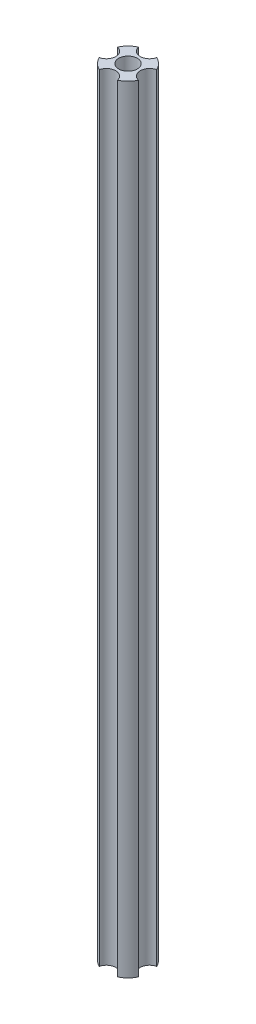
ISO-10303-21;
HEADER;
FILE_DESCRIPTION(('STEP AP214'),'2;1');
FILE_NAME('part.step','',(''),(''),'','','');
FILE_SCHEMA(('AUTOMOTIVE_DESIGN { 1 0 10303 214 1 1 1 1 }'));
ENDSEC;
DATA;
#1=APPLICATION_CONTEXT('core data for automotive mechanical design processes');
#2=APPLICATION_PROTOCOL_DEFINITION('international standard','automotive_design',2000,#1);
#3=PRODUCT_CONTEXT('',#1,'mechanical');
#4=PRODUCT('Part','Part','',(#3));
#5=PRODUCT_RELATED_PRODUCT_CATEGORY('part','',(#4));
#6=PRODUCT_DEFINITION_FORMATION('','',#4);
#7=PRODUCT_DEFINITION_CONTEXT('part definition',#1,'design');
#8=PRODUCT_DEFINITION('design','',#6,#7);
#9=PRODUCT_DEFINITION_SHAPE('','',#8);
#10=(LENGTH_UNIT() NAMED_UNIT(*) SI_UNIT(.MILLI.,.METRE.));
#11=(NAMED_UNIT(*) PLANE_ANGLE_UNIT() SI_UNIT($,.RADIAN.));
#12=(NAMED_UNIT(*) SI_UNIT($,.STERADIAN.) SOLID_ANGLE_UNIT());
#13=UNCERTAINTY_MEASURE_WITH_UNIT(LENGTH_MEASURE(1.E-05),#10,'distance_accuracy_value','');
#14=(GEOMETRIC_REPRESENTATION_CONTEXT(3) GLOBAL_UNCERTAINTY_ASSIGNED_CONTEXT((#13)) GLOBAL_UNIT_ASSIGNED_CONTEXT((#10,
#11,#12)) REPRESENTATION_CONTEXT('',''));
#15=CARTESIAN_POINT('',(0.,0.,0.));
#16=DIRECTION('',(0.,0.,1.));
#17=DIRECTION('',(1.,0.,0.));
#18=AXIS2_PLACEMENT_3D('',#15,#16,#17);
#19=CARTESIAN_POINT('',(1.7375,125.,0.));
#20=DIRECTION('',(0.,1.,0.));
#21=DIRECTION('',(0.,0.,1.));
#22=AXIS2_PLACEMENT_3D('',#19,#20,#21);
#23=PLANE('',#22);
#24=CARTESIAN_POINT('',(0.,125.,0.));
#25=DIRECTION('',(0.,1.,0.));
#26=DIRECTION('',(0.,0.,1.));
#27=AXIS2_PLACEMENT_3D('',#24,#25,#26);
#28=CIRCLE('',#27,3.475);
#29=CARTESIAN_POINT('',(1.46464731599824,125.,3.15125899280576));
#30=VERTEX_POINT('',#29);
#31=CARTESIAN_POINT('',(3.15125899280576,125.,1.46464731599824));
#32=VERTEX_POINT('',#31);
#33=EDGE_CURVE('E170',#30,#32,#28,.T.);
#34=ORIENTED_EDGE('',*,*,#33,.T.);
#35=CARTESIAN_POINT('',(3.475,125.,0.));
#36=DIRECTION('',(0.,-1.,0.));
#37=DIRECTION('',(0.,0.,1.));
#38=AXIS2_PLACEMENT_3D('',#35,#36,#37);
#39=CIRCLE('',#38,1.5);
#40=CARTESIAN_POINT('',(3.15125899280576,125.,-1.46464731599824));
#41=VERTEX_POINT('',#40);
#42=EDGE_CURVE('E106',#32,#41,#39,.T.);
#43=ORIENTED_EDGE('',*,*,#42,.T.);
#44=CARTESIAN_POINT('',(0.,125.,0.));
#45=DIRECTION('',(0.,1.,0.));
#46=DIRECTION('',(0.,0.,1.));
#47=AXIS2_PLACEMENT_3D('',#44,#45,#46);
#48=CIRCLE('',#47,3.475);
#49=CARTESIAN_POINT('',(1.46464731599824,125.,-3.15125899280576));
#50=VERTEX_POINT('',#49);
#51=EDGE_CURVE('E191',#41,#50,#48,.T.);
#52=ORIENTED_EDGE('',*,*,#51,.T.);
#53=CARTESIAN_POINT('',(0.,125.,-3.475));
#54=DIRECTION('',(0.,-1.,0.));
#55=DIRECTION('',(0.,0.,1.));
#56=AXIS2_PLACEMENT_3D('',#53,#54,#55);
#57=CIRCLE('',#56,1.5);
#58=CARTESIAN_POINT('',(-1.46464731599824,125.,-3.15125899280576));
#59=VERTEX_POINT('',#58);
#60=EDGE_CURVE('E205',#50,#59,#57,.T.);
#61=ORIENTED_EDGE('',*,*,#60,.T.);
#62=CARTESIAN_POINT('',(0.,125.,0.));
#63=DIRECTION('',(0.,1.,0.));
#64=DIRECTION('',(0.,0.,1.));
#65=AXIS2_PLACEMENT_3D('',#62,#63,#64);
#66=CIRCLE('',#65,3.475);
#67=CARTESIAN_POINT('',(-3.15125899280576,125.,-1.46464731599824));
#68=VERTEX_POINT('',#67);
#69=EDGE_CURVE('E125',#59,#68,#66,.T.);
#70=ORIENTED_EDGE('',*,*,#69,.T.);
#71=CARTESIAN_POINT('',(-3.475,125.,0.));
#72=DIRECTION('',(0.,-1.,0.));
#73=DIRECTION('',(0.,0.,1.));
#74=AXIS2_PLACEMENT_3D('',#71,#72,#73);
#75=CIRCLE('',#74,1.5);
#76=CARTESIAN_POINT('',(-3.15125899280576,125.,1.46464731599824));
#77=VERTEX_POINT('',#76);
#78=EDGE_CURVE('E119',#68,#77,#75,.T.);
#79=ORIENTED_EDGE('',*,*,#78,.T.);
#80=CARTESIAN_POINT('',(0.,125.,0.));
#81=DIRECTION('',(0.,1.,0.));
#82=DIRECTION('',(0.,0.,1.));
#83=AXIS2_PLACEMENT_3D('',#80,#81,#82);
#84=CIRCLE('',#83,3.475);
#85=CARTESIAN_POINT('',(-1.46464731599824,125.,3.15125899280576));
#86=VERTEX_POINT('',#85);
#87=EDGE_CURVE('E123',#77,#86,#84,.T.);
#88=ORIENTED_EDGE('',*,*,#87,.T.);
#89=CARTESIAN_POINT('',(0.,125.,3.475));
#90=DIRECTION('',(0.,-1.,0.));
#91=DIRECTION('',(0.,0.,1.));
#92=AXIS2_PLACEMENT_3D('',#89,#90,#91);
#93=CIRCLE('',#92,1.5);
#94=EDGE_CURVE('E63',#86,#30,#93,.T.);
#95=ORIENTED_EDGE('',*,*,#94,.T.);
#96=EDGE_LOOP('',(#34,#43,#52,#61,#70,#79,#88,#95));
#97=FACE_BOUND('',#96,.T.);
#98=CARTESIAN_POINT('',(0.,125.,0.));
#99=DIRECTION('',(0.,1.,0.));
#100=DIRECTION('',(0.,0.,1.));
#101=AXIS2_PLACEMENT_3D('',#98,#99,#100);
#102=CIRCLE('',#101,1.5);
#103=CARTESIAN_POINT('',(0.,125.,1.5));
#104=VERTEX_POINT('',#103);
#105=EDGE_CURVE('E152',#104,#104,#102,.T.);
#106=ORIENTED_EDGE('',*,*,#105,.F.);
#107=EDGE_LOOP('',(#106));
#108=FACE_BOUND('',#107,.T.);
#109=ADVANCED_FACE('F45',(#97,#108),#23,.T.);
#110=CARTESIAN_POINT('',(1.7375,0.,0.));
#111=DIRECTION('',(0.,1.,0.));
#112=DIRECTION('',(0.,0.,1.));
#113=AXIS2_PLACEMENT_3D('',#110,#111,#112);
#114=PLANE('',#113);
#115=CARTESIAN_POINT('',(0.,0.,0.));
#116=DIRECTION('',(0.,1.,0.));
#117=DIRECTION('',(0.,0.,1.));
#118=AXIS2_PLACEMENT_3D('',#115,#116,#117);
#119=CIRCLE('',#118,3.475);
#120=CARTESIAN_POINT('',(1.46464731599824,0.,3.15125899280576));
#121=VERTEX_POINT('',#120);
#122=CARTESIAN_POINT('',(3.15125899280576,0.,1.46464731599824));
#123=VERTEX_POINT('',#122);
#124=EDGE_CURVE('E147',#121,#123,#119,.T.);
#125=ORIENTED_EDGE('',*,*,#124,.F.);
#126=CARTESIAN_POINT('',(0.,0.,3.475));
#127=DIRECTION('',(0.,-1.,0.));
#128=DIRECTION('',(0.,0.,1.));
#129=AXIS2_PLACEMENT_3D('',#126,#127,#128);
#130=CIRCLE('',#129,1.5);
#131=CARTESIAN_POINT('',(-1.46464731599824,0.,3.15125899280576));
#132=VERTEX_POINT('',#131);
#133=EDGE_CURVE('E98',#132,#121,#130,.T.);
#134=ORIENTED_EDGE('',*,*,#133,.F.);
#135=CARTESIAN_POINT('',(0.,0.,0.));
#136=DIRECTION('',(0.,1.,0.));
#137=DIRECTION('',(0.,0.,1.));
#138=AXIS2_PLACEMENT_3D('',#135,#136,#137);
#139=CIRCLE('',#138,3.475);
#140=CARTESIAN_POINT('',(-3.15125899280576,0.,1.46464731599824));
#141=VERTEX_POINT('',#140);
#142=EDGE_CURVE('E92',#141,#132,#139,.T.);
#143=ORIENTED_EDGE('',*,*,#142,.F.);
#144=CARTESIAN_POINT('',(-3.475,0.,0.));
#145=DIRECTION('',(0.,-1.,0.));
#146=DIRECTION('',(0.,0.,1.));
#147=AXIS2_PLACEMENT_3D('',#144,#145,#146);
#148=CIRCLE('',#147,1.5);
#149=CARTESIAN_POINT('',(-3.15125899280576,0.,-1.46464731599824));
#150=VERTEX_POINT('',#149);
#151=EDGE_CURVE('E134',#150,#141,#148,.T.);
#152=ORIENTED_EDGE('',*,*,#151,.F.);
#153=CARTESIAN_POINT('',(0.,0.,0.));
#154=DIRECTION('',(0.,1.,0.));
#155=DIRECTION('',(0.,0.,1.));
#156=AXIS2_PLACEMENT_3D('',#153,#154,#155);
#157=CIRCLE('',#156,3.475);
#158=CARTESIAN_POINT('',(-1.46464731599824,0.,-3.15125899280576));
#159=VERTEX_POINT('',#158);
#160=EDGE_CURVE('E161',#159,#150,#157,.T.);
#161=ORIENTED_EDGE('',*,*,#160,.F.);
#162=CARTESIAN_POINT('',(0.,0.,-3.475));
#163=DIRECTION('',(0.,-1.,0.));
#164=DIRECTION('',(0.,0.,1.));
#165=AXIS2_PLACEMENT_3D('',#162,#163,#164);
#166=CIRCLE('',#165,1.5);
#167=CARTESIAN_POINT('',(1.46464731599824,0.,-3.15125899280576));
#168=VERTEX_POINT('',#167);
#169=EDGE_CURVE('E158',#168,#159,#166,.T.);
#170=ORIENTED_EDGE('',*,*,#169,.F.);
#171=CARTESIAN_POINT('',(0.,0.,0.));
#172=DIRECTION('',(0.,1.,0.));
#173=DIRECTION('',(0.,0.,1.));
#174=AXIS2_PLACEMENT_3D('',#171,#172,#173);
#175=CIRCLE('',#174,3.475);
#176=CARTESIAN_POINT('',(3.15125899280576,0.,-1.46464731599824));
#177=VERTEX_POINT('',#176);
#178=EDGE_CURVE('E155',#177,#168,#175,.T.);
#179=ORIENTED_EDGE('',*,*,#178,.F.);
#180=CARTESIAN_POINT('',(3.475,0.,0.));
#181=DIRECTION('',(0.,-1.,0.));
#182=DIRECTION('',(0.,0.,1.));
#183=AXIS2_PLACEMENT_3D('',#180,#181,#182);
#184=CIRCLE('',#183,1.5);
#185=EDGE_CURVE('E151',#123,#177,#184,.T.);
#186=ORIENTED_EDGE('',*,*,#185,.F.);
#187=EDGE_LOOP('',(#125,#134,#143,#152,#161,#170,#179,#186));
#188=FACE_BOUND('',#187,.T.);
#189=CARTESIAN_POINT('',(0.,0.,0.));
#190=DIRECTION('',(0.,1.,0.));
#191=DIRECTION('',(0.,0.,1.));
#192=AXIS2_PLACEMENT_3D('',#189,#190,#191);
#193=CIRCLE('',#192,1.5);
#194=CARTESIAN_POINT('',(0.,0.,1.5));
#195=VERTEX_POINT('',#194);
#196=EDGE_CURVE('E215',#195,#195,#193,.T.);
#197=ORIENTED_EDGE('',*,*,#196,.T.);
#198=EDGE_LOOP('',(#197));
#199=FACE_BOUND('',#198,.T.);
#200=ADVANCED_FACE('F195',(#188,#199),#114,.F.);
#201=CARTESIAN_POINT('',(0.,125.,0.));
#202=DIRECTION('',(0.,-1.,0.));
#203=DIRECTION('',(0.,0.,-1.));
#204=AXIS2_PLACEMENT_3D('',#201,#202,#203);
#205=CYLINDRICAL_SURFACE('',#204,3.475);
#206=ORIENTED_EDGE('',*,*,#124,.T.);
#207=DIRECTION('',(0.,-1.,0.));
#208=VECTOR('',#207,1.);
#209=CARTESIAN_POINT('',(3.15125899280576,125.,1.46464731599824));
#210=LINE('',#209,#208);
#211=EDGE_CURVE('E11',#32,#123,#210,.T.);
#212=ORIENTED_EDGE('',*,*,#211,.F.);
#213=ORIENTED_EDGE('',*,*,#33,.F.);
#214=DIRECTION('',(0.,-1.,0.));
#215=VECTOR('',#214,1.);
#216=CARTESIAN_POINT('',(1.46464731599824,125.,3.15125899280576));
#217=LINE('',#216,#215);
#218=EDGE_CURVE('E143',#30,#121,#217,.T.);
#219=ORIENTED_EDGE('',*,*,#218,.T.);
#220=EDGE_LOOP('',(#206,#212,#213,#219));
#221=FACE_BOUND('',#220,.T.);
#222=ADVANCED_FACE('F47',(#221),#205,.T.);
#223=CARTESIAN_POINT('',(3.475,125.,0.));
#224=DIRECTION('',(0.,-1.,0.));
#225=DIRECTION('',(0.,0.,-1.));
#226=AXIS2_PLACEMENT_3D('',#223,#224,#225);
#227=CYLINDRICAL_SURFACE('',#226,1.5);
#228=ORIENTED_EDGE('',*,*,#185,.T.);
#229=DIRECTION('',(0.,-1.,0.));
#230=VECTOR('',#229,1.);
#231=CARTESIAN_POINT('',(3.15125899280576,125.,-1.46464731599824));
#232=LINE('',#231,#230);
#233=EDGE_CURVE('E55',#41,#177,#232,.T.);
#234=ORIENTED_EDGE('',*,*,#233,.F.);
#235=ORIENTED_EDGE('',*,*,#42,.F.);
#236=ORIENTED_EDGE('',*,*,#211,.T.);
#237=EDGE_LOOP('',(#228,#234,#235,#236));
#238=FACE_BOUND('',#237,.T.);
#239=ADVANCED_FACE('F245',(#238),#227,.F.);
#240=CARTESIAN_POINT('',(0.,125.,0.));
#241=DIRECTION('',(0.,-1.,0.));
#242=DIRECTION('',(0.,0.,-1.));
#243=AXIS2_PLACEMENT_3D('',#240,#241,#242);
#244=CYLINDRICAL_SURFACE('',#243,3.475);
#245=ORIENTED_EDGE('',*,*,#178,.T.);
#246=DIRECTION('',(0.,-1.,0.));
#247=VECTOR('',#246,1.);
#248=CARTESIAN_POINT('',(1.46464731599824,125.,-3.15125899280576));
#249=LINE('',#248,#247);
#250=EDGE_CURVE('E181',#50,#168,#249,.T.);
#251=ORIENTED_EDGE('',*,*,#250,.F.);
#252=ORIENTED_EDGE('',*,*,#51,.F.);
#253=ORIENTED_EDGE('',*,*,#233,.T.);
#254=EDGE_LOOP('',(#245,#251,#252,#253));
#255=FACE_BOUND('',#254,.T.);
#256=ADVANCED_FACE('F189',(#255),#244,.T.);
#257=CARTESIAN_POINT('',(0.,125.,-3.475));
#258=DIRECTION('',(0.,-1.,0.));
#259=DIRECTION('',(0.,0.,-1.));
#260=AXIS2_PLACEMENT_3D('',#257,#258,#259);
#261=CYLINDRICAL_SURFACE('',#260,1.5);
#262=ORIENTED_EDGE('',*,*,#169,.T.);
#263=DIRECTION('',(0.,-1.,0.));
#264=VECTOR('',#263,1.);
#265=CARTESIAN_POINT('',(-1.46464731599824,125.,-3.15125899280576));
#266=LINE('',#265,#264);
#267=EDGE_CURVE('E177',#59,#159,#266,.T.);
#268=ORIENTED_EDGE('',*,*,#267,.F.);
#269=ORIENTED_EDGE('',*,*,#60,.F.);
#270=ORIENTED_EDGE('',*,*,#250,.T.);
#271=EDGE_LOOP('',(#262,#268,#269,#270));
#272=FACE_BOUND('',#271,.T.);
#273=ADVANCED_FACE('F200',(#272),#261,.F.);
#274=CARTESIAN_POINT('',(0.,125.,0.));
#275=DIRECTION('',(0.,-1.,0.));
#276=DIRECTION('',(0.,0.,-1.));
#277=AXIS2_PLACEMENT_3D('',#274,#275,#276);
#278=CYLINDRICAL_SURFACE('',#277,3.475);
#279=ORIENTED_EDGE('',*,*,#160,.T.);
#280=DIRECTION('',(0.,-1.,0.));
#281=VECTOR('',#280,1.);
#282=CARTESIAN_POINT('',(-3.15125899280576,125.,-1.46464731599824));
#283=LINE('',#282,#281);
#284=EDGE_CURVE('E136',#68,#150,#283,.T.);
#285=ORIENTED_EDGE('',*,*,#284,.F.);
#286=ORIENTED_EDGE('',*,*,#69,.F.);
#287=ORIENTED_EDGE('',*,*,#267,.T.);
#288=EDGE_LOOP('',(#279,#285,#286,#287));
#289=FACE_BOUND('',#288,.T.);
#290=ADVANCED_FACE('F203',(#289),#278,.T.);
#291=CARTESIAN_POINT('',(-3.475,125.,0.));
#292=DIRECTION('',(0.,-1.,0.));
#293=DIRECTION('',(0.,0.,-1.));
#294=AXIS2_PLACEMENT_3D('',#291,#292,#293);
#295=CYLINDRICAL_SURFACE('',#294,1.5);
#296=ORIENTED_EDGE('',*,*,#151,.T.);
#297=DIRECTION('',(0.,-1.,0.));
#298=VECTOR('',#297,1.);
#299=CARTESIAN_POINT('',(-3.15125899280576,125.,1.46464731599824));
#300=LINE('',#299,#298);
#301=EDGE_CURVE('E131',#77,#141,#300,.T.);
#302=ORIENTED_EDGE('',*,*,#301,.F.);
#303=ORIENTED_EDGE('',*,*,#78,.F.);
#304=ORIENTED_EDGE('',*,*,#284,.T.);
#305=EDGE_LOOP('',(#296,#302,#303,#304));
#306=FACE_BOUND('',#305,.T.);
#307=ADVANCED_FACE('F132',(#306),#295,.F.);
#308=CARTESIAN_POINT('',(0.,125.,0.));
#309=DIRECTION('',(0.,-1.,0.));
#310=DIRECTION('',(0.,0.,-1.));
#311=AXIS2_PLACEMENT_3D('',#308,#309,#310);
#312=CYLINDRICAL_SURFACE('',#311,3.475);
#313=ORIENTED_EDGE('',*,*,#142,.T.);
#314=DIRECTION('',(0.,-1.,0.));
#315=VECTOR('',#314,1.);
#316=CARTESIAN_POINT('',(-1.46464731599824,125.,3.15125899280576));
#317=LINE('',#316,#315);
#318=EDGE_CURVE('E137',#86,#132,#317,.T.);
#319=ORIENTED_EDGE('',*,*,#318,.F.);
#320=ORIENTED_EDGE('',*,*,#87,.F.);
#321=ORIENTED_EDGE('',*,*,#301,.T.);
#322=EDGE_LOOP('',(#313,#319,#320,#321));
#323=FACE_BOUND('',#322,.T.);
#324=ADVANCED_FACE('F139',(#323),#312,.T.);
#325=CARTESIAN_POINT('',(0.,125.,3.475));
#326=DIRECTION('',(0.,-1.,0.));
#327=DIRECTION('',(0.,0.,-1.));
#328=AXIS2_PLACEMENT_3D('',#325,#326,#327);
#329=CYLINDRICAL_SURFACE('',#328,1.5);
#330=ORIENTED_EDGE('',*,*,#133,.T.);
#331=ORIENTED_EDGE('',*,*,#218,.F.);
#332=ORIENTED_EDGE('',*,*,#94,.F.);
#333=ORIENTED_EDGE('',*,*,#318,.T.);
#334=EDGE_LOOP('',(#330,#331,#332,#333));
#335=FACE_BOUND('',#334,.T.);
#336=ADVANCED_FACE('F233',(#335),#329,.F.);
#337=CARTESIAN_POINT('',(0.,125.,0.));
#338=DIRECTION('',(0.,-1.,0.));
#339=DIRECTION('',(0.,0.,-1.));
#340=AXIS2_PLACEMENT_3D('',#337,#338,#339);
#341=CYLINDRICAL_SURFACE('',#340,1.5);
#342=ORIENTED_EDGE('',*,*,#105,.T.);
#343=EDGE_LOOP('',(#342));
#344=FACE_BOUND('',#343,.T.);
#345=ORIENTED_EDGE('',*,*,#196,.F.);
#346=EDGE_LOOP('',(#345));
#347=FACE_BOUND('',#346,.T.);
#348=ADVANCED_FACE('F223',(#344,#347),#341,.F.);
#349=CLOSED_SHELL('',(#109,#200,#222,#239,#256,#273,#290,#307,#324,#336,#348));
#350=MANIFOLD_SOLID_BREP('B2',#349);
#351=ADVANCED_BREP_SHAPE_REPRESENTATION('',(#18,#350),#14);
#352=SHAPE_DEFINITION_REPRESENTATION(#9,#351);
ENDSEC;
END-ISO-10303-21;
